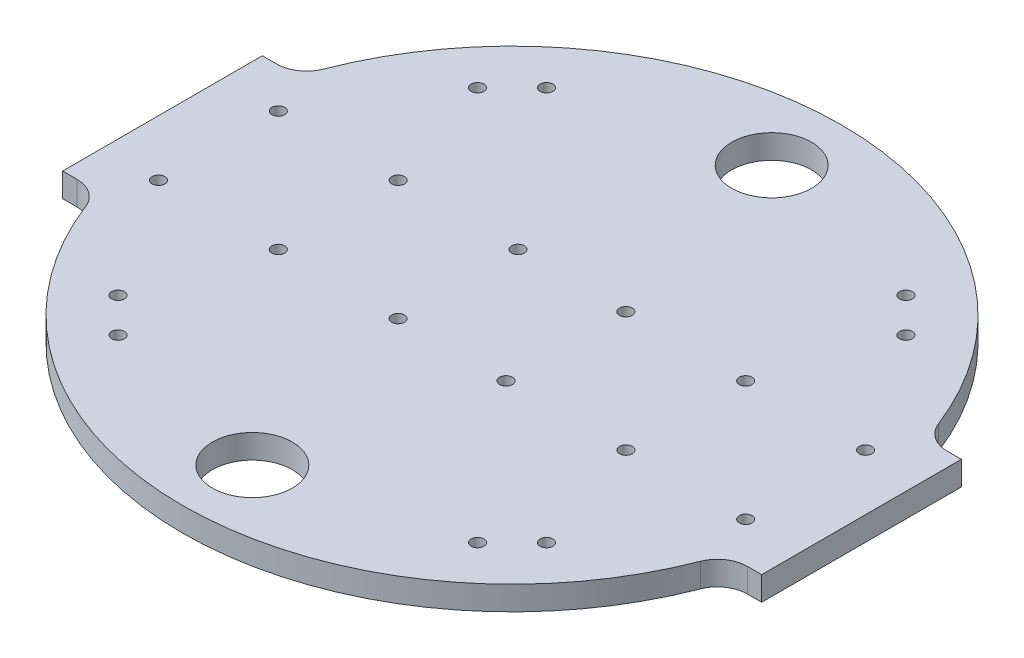
ISO-10303-21;
HEADER;
FILE_DESCRIPTION(('STEP AP214'),'2;1');
FILE_NAME('part.step','',(''),(''),'','','');
FILE_SCHEMA(('AUTOMOTIVE_DESIGN { 1 0 10303 214 1 1 1 1 }'));
ENDSEC;
DATA;
#1=APPLICATION_CONTEXT('core data for automotive mechanical design processes');
#2=APPLICATION_PROTOCOL_DEFINITION('international standard','automotive_design',2000,#1);
#3=PRODUCT_CONTEXT('',#1,'mechanical');
#4=PRODUCT('Part','Part','',(#3));
#5=PRODUCT_RELATED_PRODUCT_CATEGORY('part','',(#4));
#6=PRODUCT_DEFINITION_FORMATION('','',#4);
#7=PRODUCT_DEFINITION_CONTEXT('part definition',#1,'design');
#8=PRODUCT_DEFINITION('design','',#6,#7);
#9=PRODUCT_DEFINITION_SHAPE('','',#8);
#10=(LENGTH_UNIT() NAMED_UNIT(*) SI_UNIT(.MILLI.,.METRE.));
#11=(NAMED_UNIT(*) PLANE_ANGLE_UNIT() SI_UNIT($,.RADIAN.));
#12=(NAMED_UNIT(*) SI_UNIT($,.STERADIAN.) SOLID_ANGLE_UNIT());
#13=UNCERTAINTY_MEASURE_WITH_UNIT(LENGTH_MEASURE(1.E-05),#10,'distance_accuracy_value','');
#14=(GEOMETRIC_REPRESENTATION_CONTEXT(3) GLOBAL_UNCERTAINTY_ASSIGNED_CONTEXT((#13)) GLOBAL_UNIT_ASSIGNED_CONTEXT((#10,
#11,#12)) REPRESENTATION_CONTEXT('',''));
#15=CARTESIAN_POINT('',(0.,0.,0.));
#16=DIRECTION('',(0.,0.,1.));
#17=DIRECTION('',(1.,0.,0.));
#18=AXIS2_PLACEMENT_3D('',#15,#16,#17);
#19=CARTESIAN_POINT('',(0.,6.,0.));
#20=DIRECTION('',(0.,1.,0.));
#21=DIRECTION('',(0.,0.,1.));
#22=AXIS2_PLACEMENT_3D('',#19,#20,#21);
#23=PLANE('',#22);
#24=CARTESIAN_POINT('',(73.5,6.,15.));
#25=DIRECTION('',(0.,1.,0.));
#26=DIRECTION('',(0.,0.,1.));
#27=AXIS2_PLACEMENT_3D('',#24,#25,#26);
#28=CIRCLE('',#27,1.6);
#29=CARTESIAN_POINT('',(73.5,6.,16.6));
#30=VERTEX_POINT('',#29);
#31=EDGE_CURVE('E413',#30,#30,#28,.T.);
#32=ORIENTED_EDGE('',*,*,#31,.F.);
#33=EDGE_LOOP('',(#32));
#34=FACE_BOUND('',#33,.T.);
#35=CARTESIAN_POINT('',(43.5,6.,-15.));
#36=DIRECTION('',(0.,1.,0.));
#37=DIRECTION('',(0.,0.,-1.));
#38=AXIS2_PLACEMENT_3D('',#35,#36,#37);
#39=CIRCLE('',#38,1.6);
#40=CARTESIAN_POINT('',(43.5,6.,-16.6));
#41=VERTEX_POINT('',#40);
#42=EDGE_CURVE('E401',#41,#41,#39,.T.);
#43=ORIENTED_EDGE('',*,*,#42,.F.);
#44=EDGE_LOOP('',(#43));
#45=FACE_BOUND('',#44,.T.);
#46=CARTESIAN_POINT('',(-13.5,6.,15.));
#47=DIRECTION('',(0.,1.,0.));
#48=DIRECTION('',(0.,0.,-1.));
#49=AXIS2_PLACEMENT_3D('',#46,#47,#48);
#50=CIRCLE('',#49,1.6);
#51=CARTESIAN_POINT('',(-13.5,6.,13.4));
#52=VERTEX_POINT('',#51);
#53=EDGE_CURVE('E389',#52,#52,#50,.T.);
#54=ORIENTED_EDGE('',*,*,#53,.F.);
#55=EDGE_LOOP('',(#54));
#56=FACE_BOUND('',#55,.T.);
#57=CARTESIAN_POINT('',(-43.5,6.,15.));
#58=DIRECTION('',(0.,1.,0.));
#59=DIRECTION('',(0.,0.,-1.));
#60=AXIS2_PLACEMENT_3D('',#57,#58,#59);
#61=CIRCLE('',#60,1.6);
#62=CARTESIAN_POINT('',(-43.5,6.,13.4));
#63=VERTEX_POINT('',#62);
#64=EDGE_CURVE('E377',#63,#63,#61,.T.);
#65=ORIENTED_EDGE('',*,*,#64,.F.);
#66=EDGE_LOOP('',(#65));
#67=FACE_BOUND('',#66,.T.);
#68=CARTESIAN_POINT('',(13.5,6.,15.));
#69=DIRECTION('',(0.,1.,0.));
#70=DIRECTION('',(0.,0.,1.));
#71=AXIS2_PLACEMENT_3D('',#68,#69,#70);
#72=CIRCLE('',#71,1.6);
#73=CARTESIAN_POINT('',(13.5,6.,16.6));
#74=VERTEX_POINT('',#73);
#75=EDGE_CURVE('E365',#74,#74,#72,.T.);
#76=ORIENTED_EDGE('',*,*,#75,.F.);
#77=EDGE_LOOP('',(#76));
#78=FACE_BOUND('',#77,.T.);
#79=CARTESIAN_POINT('',(-73.5,6.,-15.));
#80=DIRECTION('',(0.,1.,0.));
#81=DIRECTION('',(0.,0.,1.));
#82=AXIS2_PLACEMENT_3D('',#79,#80,#81);
#83=CIRCLE('',#82,1.6);
#84=CARTESIAN_POINT('',(-73.5,6.,-13.4));
#85=VERTEX_POINT('',#84);
#86=EDGE_CURVE('E353',#85,#85,#83,.T.);
#87=ORIENTED_EDGE('',*,*,#86,.F.);
#88=EDGE_LOOP('',(#87));
#89=FACE_BOUND('',#88,.T.);
#90=CARTESIAN_POINT('',(-53.6231110183226,6.,44.9951326780585));
#91=DIRECTION('',(0.,1.,0.));
#92=DIRECTION('',(0.,0.,1.));
#93=AXIS2_PLACEMENT_3D('',#90,#91,#92);
#94=CIRCLE('',#93,1.60000000000277);
#95=CARTESIAN_POINT('',(-53.6231110183226,6.,46.5951326780613));
#96=VERTEX_POINT('',#95);
#97=EDGE_CURVE('E341',#96,#96,#94,.T.);
#98=ORIENTED_EDGE('',*,*,#97,.F.);
#99=EDGE_LOOP('',(#98));
#100=FACE_BOUND('',#99,.T.);
#101=CARTESIAN_POINT('',(44.9951326780641,6.,53.6231110183231));
#102=DIRECTION('',(0.,1.,0.));
#103=DIRECTION('',(0.,0.,1.));
#104=AXIS2_PLACEMENT_3D('',#101,#102,#103);
#105=CIRCLE('',#104,1.60000000000774);
#106=CARTESIAN_POINT('',(44.9951326780641,6.,55.2231110183308));
#107=VERTEX_POINT('',#106);
#108=EDGE_CURVE('E329',#107,#107,#105,.T.);
#109=ORIENTED_EDGE('',*,*,#108,.F.);
#110=EDGE_LOOP('',(#109));
#111=FACE_BOUND('',#110,.T.);
#112=CARTESIAN_POINT('',(53.6231110183287,6.,-44.9951326780636));
#113=DIRECTION('',(0.,1.,0.));
#114=DIRECTION('',(0.,0.,1.));
#115=AXIS2_PLACEMENT_3D('',#112,#113,#114);
#116=CIRCLE('',#115,1.60000000000543);
#117=CARTESIAN_POINT('',(53.6231110183287,6.,-43.3951326780582));
#118=VERTEX_POINT('',#117);
#119=EDGE_CURVE('E317',#118,#118,#116,.T.);
#120=ORIENTED_EDGE('',*,*,#119,.F.);
#121=EDGE_LOOP('',(#120));
#122=FACE_BOUND('',#121,.T.);
#123=CARTESIAN_POINT('',(0.,6.,-65.));
#124=DIRECTION('',(0.,1.,0.));
#125=DIRECTION('',(0.,0.,1.));
#126=AXIS2_PLACEMENT_3D('',#123,#124,#125);
#127=CIRCLE('',#126,10.);
#128=CARTESIAN_POINT('',(0.,6.,-55.));
#129=VERTEX_POINT('',#128);
#130=EDGE_CURVE('E305',#129,#129,#127,.T.);
#131=ORIENTED_EDGE('',*,*,#130,.F.);
#132=EDGE_LOOP('',(#131));
#133=FACE_BOUND('',#132,.T.);
#134=CARTESIAN_POINT('',(-53.6231110183287,6.,-44.9951326780575));
#135=DIRECTION('',(0.,1.,0.));
#136=DIRECTION('',(0.,0.,1.));
#137=AXIS2_PLACEMENT_3D('',#134,#135,#136);
#138=CIRCLE('',#137,1.6);
#139=CARTESIAN_POINT('',(-53.6231110183287,6.,-43.3951326780575));
#140=VERTEX_POINT('',#139);
#141=EDGE_CURVE('E159',#140,#140,#138,.T.);
#142=ORIENTED_EDGE('',*,*,#141,.F.);
#143=EDGE_LOOP('',(#142));
#144=FACE_BOUND('',#143,.T.);
#145=DIRECTION('',(1.,0.,0.));
#146=VECTOR('',#145,1.);
#147=CARTESIAN_POINT('',(-87.5,6.,25.));
#148=LINE('',#147,#146);
#149=CARTESIAN_POINT('',(-87.5,6.,25.));
#150=VERTEX_POINT('',#149);
#151=CARTESIAN_POINT('',(-83.9270516579726,6.,25.));
#152=VERTEX_POINT('',#151);
#153=EDGE_CURVE('E175',#150,#152,#148,.T.);
#154=ORIENTED_EDGE('',*,*,#153,.T.);
#155=CARTESIAN_POINT('',(-83.9270516579726,6.,32.5));
#156=DIRECTION('',(0.,1.,0.));
#157=DIRECTION('',(0.,0.,1.));
#158=AXIS2_PLACEMENT_3D('',#155,#156,#157);
#159=CIRCLE('',#158,7.5);
#160=CARTESIAN_POINT('',(-76.9331306864749,6.,29.7916666666667));
#161=VERTEX_POINT('',#160);
#162=EDGE_CURVE('E202',#152,#161,#159,.F.);
#163=ORIENTED_EDGE('',*,*,#162,.T.);
#164=CARTESIAN_POINT('',(0.,6.,0.));
#165=DIRECTION('',(0.,1.,0.));
#166=DIRECTION('',(0.,0.,1.));
#167=AXIS2_PLACEMENT_3D('',#164,#165,#166);
#168=CIRCLE('',#167,82.5);
#169=CARTESIAN_POINT('',(76.9331306864749,6.,29.7916666666667));
#170=VERTEX_POINT('',#169);
#171=EDGE_CURVE('E127',#161,#170,#168,.T.);
#172=ORIENTED_EDGE('',*,*,#171,.T.);
#173=CARTESIAN_POINT('',(83.9270516579726,6.,32.5));
#174=DIRECTION('',(0.,1.,0.));
#175=DIRECTION('',(0.,0.,1.));
#176=AXIS2_PLACEMENT_3D('',#173,#174,#175);
#177=CIRCLE('',#176,7.5);
#178=CARTESIAN_POINT('',(83.9270516579726,6.,25.));
#179=VERTEX_POINT('',#178);
#180=EDGE_CURVE('E11',#170,#179,#177,.F.);
#181=ORIENTED_EDGE('',*,*,#180,.T.);
#182=DIRECTION('',(1.,0.,0.));
#183=VECTOR('',#182,1.);
#184=CARTESIAN_POINT('',(87.5,6.,25.));
#185=LINE('',#184,#183);
#186=CARTESIAN_POINT('',(87.5,6.,25.));
#187=VERTEX_POINT('',#186);
#188=EDGE_CURVE('E118',#179,#187,#185,.T.);
#189=ORIENTED_EDGE('',*,*,#188,.T.);
#190=DIRECTION('',(0.,0.,-1.));
#191=VECTOR('',#190,1.);
#192=CARTESIAN_POINT('',(87.5,6.,25.));
#193=LINE('',#192,#191);
#194=CARTESIAN_POINT('',(87.5,6.,-25.));
#195=VERTEX_POINT('',#194);
#196=EDGE_CURVE('E124',#187,#195,#193,.T.);
#197=ORIENTED_EDGE('',*,*,#196,.T.);
#198=DIRECTION('',(-1.,0.,0.));
#199=VECTOR('',#198,1.);
#200=CARTESIAN_POINT('',(87.5,6.,-25.));
#201=LINE('',#200,#199);
#202=CARTESIAN_POINT('',(83.9270516579726,6.,-25.));
#203=VERTEX_POINT('',#202);
#204=EDGE_CURVE('E142',#195,#203,#201,.T.);
#205=ORIENTED_EDGE('',*,*,#204,.T.);
#206=CARTESIAN_POINT('',(83.9270516579726,6.,-32.5));
#207=DIRECTION('',(0.,1.,0.));
#208=DIRECTION('',(0.,0.,1.));
#209=AXIS2_PLACEMENT_3D('',#206,#207,#208);
#210=CIRCLE('',#209,7.5);
#211=CARTESIAN_POINT('',(76.9331306864749,6.,-29.7916666666667));
#212=VERTEX_POINT('',#211);
#213=EDGE_CURVE('E210',#203,#212,#210,.F.);
#214=ORIENTED_EDGE('',*,*,#213,.T.);
#215=CARTESIAN_POINT('',(0.,6.,0.));
#216=DIRECTION('',(0.,1.,0.));
#217=DIRECTION('',(0.,0.,1.));
#218=AXIS2_PLACEMENT_3D('',#215,#216,#217);
#219=CIRCLE('',#218,82.5);
#220=CARTESIAN_POINT('',(-76.9331306864749,6.,-29.7916666666667));
#221=VERTEX_POINT('',#220);
#222=EDGE_CURVE('E144',#212,#221,#219,.T.);
#223=ORIENTED_EDGE('',*,*,#222,.T.);
#224=CARTESIAN_POINT('',(-83.9270516579726,6.,-32.5));
#225=DIRECTION('',(0.,1.,0.));
#226=DIRECTION('',(0.,0.,1.));
#227=AXIS2_PLACEMENT_3D('',#224,#225,#226);
#228=CIRCLE('',#227,7.5);
#229=CARTESIAN_POINT('',(-83.9270516579726,6.,-25.));
#230=VERTEX_POINT('',#229);
#231=EDGE_CURVE('E206',#221,#230,#228,.F.);
#232=ORIENTED_EDGE('',*,*,#231,.T.);
#233=DIRECTION('',(-1.,0.,0.));
#234=VECTOR('',#233,1.);
#235=CARTESIAN_POINT('',(-87.5,6.,-25.));
#236=LINE('',#235,#234);
#237=CARTESIAN_POINT('',(-87.5,6.,-25.));
#238=VERTEX_POINT('',#237);
#239=EDGE_CURVE('E150',#230,#238,#236,.T.);
#240=ORIENTED_EDGE('',*,*,#239,.T.);
#241=DIRECTION('',(0.,0.,1.));
#242=VECTOR('',#241,1.);
#243=CARTESIAN_POINT('',(-87.5,6.,25.));
#244=LINE('',#243,#242);
#245=EDGE_CURVE('E152',#238,#150,#244,.T.);
#246=ORIENTED_EDGE('',*,*,#245,.T.);
#247=EDGE_LOOP('',(#154,#163,#172,#181,#189,#197,#205,#214,#223,#232,#240,#246));
#248=FACE_BOUND('',#247,.T.);
#249=CARTESIAN_POINT('',(-44.9951326780581,6.,-53.6231110183282));
#250=DIRECTION('',(0.,1.,0.));
#251=DIRECTION('',(0.,0.,1.));
#252=AXIS2_PLACEMENT_3D('',#249,#250,#251);
#253=CIRCLE('',#252,1.59999999999999);
#254=CARTESIAN_POINT('',(-44.9951326780581,6.,-52.0231110183282));
#255=VERTEX_POINT('',#254);
#256=EDGE_CURVE('E299',#255,#255,#253,.T.);
#257=ORIENTED_EDGE('',*,*,#256,.F.);
#258=EDGE_LOOP('',(#257));
#259=FACE_BOUND('',#258,.T.);
#260=CARTESIAN_POINT('',(44.9951326780579,6.,-53.6231110183343));
#261=DIRECTION('',(0.,1.,0.));
#262=DIRECTION('',(0.,0.,1.));
#263=AXIS2_PLACEMENT_3D('',#260,#261,#262);
#264=CIRCLE('',#263,1.60000000000543);
#265=CARTESIAN_POINT('',(44.9951326780579,6.,-52.0231110183289));
#266=VERTEX_POINT('',#265);
#267=EDGE_CURVE('E311',#266,#266,#264,.T.);
#268=ORIENTED_EDGE('',*,*,#267,.F.);
#269=EDGE_LOOP('',(#268));
#270=FACE_BOUND('',#269,.T.);
#271=CARTESIAN_POINT('',(53.6231110183348,6.,44.9951326780523));
#272=DIRECTION('',(0.,1.,0.));
#273=DIRECTION('',(0.,0.,1.));
#274=AXIS2_PLACEMENT_3D('',#271,#272,#273);
#275=CIRCLE('',#274,1.60000000000772);
#276=CARTESIAN_POINT('',(53.6231110183348,6.,46.59513267806));
#277=VERTEX_POINT('',#276);
#278=EDGE_CURVE('E323',#277,#277,#275,.T.);
#279=ORIENTED_EDGE('',*,*,#278,.F.);
#280=EDGE_LOOP('',(#279));
#281=FACE_BOUND('',#280,.T.);
#282=CARTESIAN_POINT('',(-44.9951326780519,6.,53.6231110183292));
#283=DIRECTION('',(0.,1.,0.));
#284=DIRECTION('',(0.,0.,1.));
#285=AXIS2_PLACEMENT_3D('',#282,#283,#284);
#286=CIRCLE('',#285,1.60000000000273);
#287=CARTESIAN_POINT('',(-44.9951326780519,6.,55.223111018332));
#288=VERTEX_POINT('',#287);
#289=EDGE_CURVE('E335',#288,#288,#286,.T.);
#290=ORIENTED_EDGE('',*,*,#289,.F.);
#291=EDGE_LOOP('',(#290));
#292=FACE_BOUND('',#291,.T.);
#293=CARTESIAN_POINT('',(0.,6.,65.));
#294=DIRECTION('',(0.,1.,0.));
#295=DIRECTION('',(0.,0.,-1.));
#296=AXIS2_PLACEMENT_3D('',#293,#294,#295);
#297=CIRCLE('',#296,10.);
#298=CARTESIAN_POINT('',(0.,6.,55.));
#299=VERTEX_POINT('',#298);
#300=EDGE_CURVE('E347',#299,#299,#297,.T.);
#301=ORIENTED_EDGE('',*,*,#300,.F.);
#302=EDGE_LOOP('',(#301));
#303=FACE_BOUND('',#302,.T.);
#304=CARTESIAN_POINT('',(-73.5,6.,15.));
#305=DIRECTION('',(0.,1.,0.));
#306=DIRECTION('',(0.,0.,-1.));
#307=AXIS2_PLACEMENT_3D('',#304,#305,#306);
#308=CIRCLE('',#307,1.6);
#309=CARTESIAN_POINT('',(-73.5,6.,13.4));
#310=VERTEX_POINT('',#309);
#311=EDGE_CURVE('E359',#310,#310,#308,.T.);
#312=ORIENTED_EDGE('',*,*,#311,.F.);
#313=EDGE_LOOP('',(#312));
#314=FACE_BOUND('',#313,.T.);
#315=CARTESIAN_POINT('',(-43.5,6.,-15.));
#316=DIRECTION('',(0.,1.,0.));
#317=DIRECTION('',(0.,0.,1.));
#318=AXIS2_PLACEMENT_3D('',#315,#316,#317);
#319=CIRCLE('',#318,1.6);
#320=CARTESIAN_POINT('',(-43.5,6.,-13.4));
#321=VERTEX_POINT('',#320);
#322=EDGE_CURVE('E371',#321,#321,#319,.T.);
#323=ORIENTED_EDGE('',*,*,#322,.F.);
#324=EDGE_LOOP('',(#323));
#325=FACE_BOUND('',#324,.T.);
#326=CARTESIAN_POINT('',(-13.5,6.,-15.));
#327=DIRECTION('',(0.,1.,0.));
#328=DIRECTION('',(0.,0.,1.));
#329=AXIS2_PLACEMENT_3D('',#326,#327,#328);
#330=CIRCLE('',#329,1.6);
#331=CARTESIAN_POINT('',(-13.5,6.,-13.4));
#332=VERTEX_POINT('',#331);
#333=EDGE_CURVE('E383',#332,#332,#330,.T.);
#334=ORIENTED_EDGE('',*,*,#333,.F.);
#335=EDGE_LOOP('',(#334));
#336=FACE_BOUND('',#335,.T.);
#337=CARTESIAN_POINT('',(13.5,6.,-15.));
#338=DIRECTION('',(0.,1.,0.));
#339=DIRECTION('',(0.,0.,-1.));
#340=AXIS2_PLACEMENT_3D('',#337,#338,#339);
#341=CIRCLE('',#340,1.6);
#342=CARTESIAN_POINT('',(13.5,6.,-16.6));
#343=VERTEX_POINT('',#342);
#344=EDGE_CURVE('E395',#343,#343,#341,.T.);
#345=ORIENTED_EDGE('',*,*,#344,.F.);
#346=EDGE_LOOP('',(#345));
#347=FACE_BOUND('',#346,.T.);
#348=CARTESIAN_POINT('',(43.5,6.,15.));
#349=DIRECTION('',(0.,1.,0.));
#350=DIRECTION('',(0.,0.,1.));
#351=AXIS2_PLACEMENT_3D('',#348,#349,#350);
#352=CIRCLE('',#351,1.6);
#353=CARTESIAN_POINT('',(43.5,6.,16.6));
#354=VERTEX_POINT('',#353);
#355=EDGE_CURVE('E407',#354,#354,#352,.T.);
#356=ORIENTED_EDGE('',*,*,#355,.F.);
#357=EDGE_LOOP('',(#356));
#358=FACE_BOUND('',#357,.T.);
#359=CARTESIAN_POINT('',(73.5,6.,-15.));
#360=DIRECTION('',(0.,1.,0.));
#361=DIRECTION('',(0.,0.,-1.));
#362=AXIS2_PLACEMENT_3D('',#359,#360,#361);
#363=CIRCLE('',#362,1.6);
#364=CARTESIAN_POINT('',(73.5,6.,-16.6));
#365=VERTEX_POINT('',#364);
#366=EDGE_CURVE('E419',#365,#365,#363,.T.);
#367=ORIENTED_EDGE('',*,*,#366,.F.);
#368=EDGE_LOOP('',(#367));
#369=FACE_BOUND('',#368,.T.);
#370=ADVANCED_FACE('F33',(#34,#45,#56,#67,#78,#89,#100,#111,#122,#133,#144,#248,#259,#270,#281,
#292,#303,#314,#325,#336,#347,#358,#369),#23,.T.);
#371=CARTESIAN_POINT('',(0.,0.,0.));
#372=DIRECTION('',(0.,1.,0.));
#373=DIRECTION('',(0.,0.,1.));
#374=AXIS2_PLACEMENT_3D('',#371,#372,#373);
#375=PLANE('',#374);
#376=CARTESIAN_POINT('',(73.5,0.,15.));
#377=DIRECTION('',(0.,1.,0.));
#378=DIRECTION('',(0.,0.,1.));
#379=AXIS2_PLACEMENT_3D('',#376,#377,#378);
#380=CIRCLE('',#379,1.6);
#381=CARTESIAN_POINT('',(73.5,0.,16.6));
#382=VERTEX_POINT('',#381);
#383=EDGE_CURVE('E416',#382,#382,#380,.T.);
#384=ORIENTED_EDGE('',*,*,#383,.T.);
#385=EDGE_LOOP('',(#384));
#386=FACE_BOUND('',#385,.T.);
#387=CARTESIAN_POINT('',(43.5,0.,-15.));
#388=DIRECTION('',(0.,1.,0.));
#389=DIRECTION('',(0.,0.,-1.));
#390=AXIS2_PLACEMENT_3D('',#387,#388,#389);
#391=CIRCLE('',#390,1.6);
#392=CARTESIAN_POINT('',(43.5,0.,-16.6));
#393=VERTEX_POINT('',#392);
#394=EDGE_CURVE('E404',#393,#393,#391,.T.);
#395=ORIENTED_EDGE('',*,*,#394,.T.);
#396=EDGE_LOOP('',(#395));
#397=FACE_BOUND('',#396,.T.);
#398=CARTESIAN_POINT('',(-13.5,0.,15.));
#399=DIRECTION('',(0.,1.,0.));
#400=DIRECTION('',(0.,0.,-1.));
#401=AXIS2_PLACEMENT_3D('',#398,#399,#400);
#402=CIRCLE('',#401,1.6);
#403=CARTESIAN_POINT('',(-13.5,0.,13.4));
#404=VERTEX_POINT('',#403);
#405=EDGE_CURVE('E392',#404,#404,#402,.T.);
#406=ORIENTED_EDGE('',*,*,#405,.T.);
#407=EDGE_LOOP('',(#406));
#408=FACE_BOUND('',#407,.T.);
#409=CARTESIAN_POINT('',(-43.5,0.,15.));
#410=DIRECTION('',(0.,1.,0.));
#411=DIRECTION('',(0.,0.,-1.));
#412=AXIS2_PLACEMENT_3D('',#409,#410,#411);
#413=CIRCLE('',#412,1.6);
#414=CARTESIAN_POINT('',(-43.5,0.,13.4));
#415=VERTEX_POINT('',#414);
#416=EDGE_CURVE('E380',#415,#415,#413,.T.);
#417=ORIENTED_EDGE('',*,*,#416,.T.);
#418=EDGE_LOOP('',(#417));
#419=FACE_BOUND('',#418,.T.);
#420=CARTESIAN_POINT('',(13.5,0.,15.));
#421=DIRECTION('',(0.,1.,0.));
#422=DIRECTION('',(0.,0.,1.));
#423=AXIS2_PLACEMENT_3D('',#420,#421,#422);
#424=CIRCLE('',#423,1.6);
#425=CARTESIAN_POINT('',(13.5,0.,16.6));
#426=VERTEX_POINT('',#425);
#427=EDGE_CURVE('E368',#426,#426,#424,.T.);
#428=ORIENTED_EDGE('',*,*,#427,.T.);
#429=EDGE_LOOP('',(#428));
#430=FACE_BOUND('',#429,.T.);
#431=CARTESIAN_POINT('',(-73.5,0.,-15.));
#432=DIRECTION('',(0.,1.,0.));
#433=DIRECTION('',(0.,0.,1.));
#434=AXIS2_PLACEMENT_3D('',#431,#432,#433);
#435=CIRCLE('',#434,1.6);
#436=CARTESIAN_POINT('',(-73.5,0.,-13.4));
#437=VERTEX_POINT('',#436);
#438=EDGE_CURVE('E356',#437,#437,#435,.T.);
#439=ORIENTED_EDGE('',*,*,#438,.T.);
#440=EDGE_LOOP('',(#439));
#441=FACE_BOUND('',#440,.T.);
#442=CARTESIAN_POINT('',(-53.6231110183226,0.,44.9951326780585));
#443=DIRECTION('',(0.,1.,0.));
#444=DIRECTION('',(0.,0.,1.));
#445=AXIS2_PLACEMENT_3D('',#442,#443,#444);
#446=CIRCLE('',#445,1.60000000000277);
#447=CARTESIAN_POINT('',(-53.6231110183226,0.,46.5951326780613));
#448=VERTEX_POINT('',#447);
#449=EDGE_CURVE('E344',#448,#448,#446,.T.);
#450=ORIENTED_EDGE('',*,*,#449,.T.);
#451=EDGE_LOOP('',(#450));
#452=FACE_BOUND('',#451,.T.);
#453=CARTESIAN_POINT('',(44.9951326780641,0.,53.6231110183231));
#454=DIRECTION('',(0.,1.,0.));
#455=DIRECTION('',(0.,0.,1.));
#456=AXIS2_PLACEMENT_3D('',#453,#454,#455);
#457=CIRCLE('',#456,1.60000000000774);
#458=CARTESIAN_POINT('',(44.9951326780641,0.,55.2231110183308));
#459=VERTEX_POINT('',#458);
#460=EDGE_CURVE('E332',#459,#459,#457,.T.);
#461=ORIENTED_EDGE('',*,*,#460,.T.);
#462=EDGE_LOOP('',(#461));
#463=FACE_BOUND('',#462,.T.);
#464=CARTESIAN_POINT('',(53.6231110183287,0.,-44.9951326780636));
#465=DIRECTION('',(0.,1.,0.));
#466=DIRECTION('',(0.,0.,1.));
#467=AXIS2_PLACEMENT_3D('',#464,#465,#466);
#468=CIRCLE('',#467,1.60000000000543);
#469=CARTESIAN_POINT('',(53.6231110183287,0.,-43.3951326780582));
#470=VERTEX_POINT('',#469);
#471=EDGE_CURVE('E320',#470,#470,#468,.T.);
#472=ORIENTED_EDGE('',*,*,#471,.T.);
#473=EDGE_LOOP('',(#472));
#474=FACE_BOUND('',#473,.T.);
#475=CARTESIAN_POINT('',(0.,0.,-65.));
#476=DIRECTION('',(0.,1.,0.));
#477=DIRECTION('',(0.,0.,1.));
#478=AXIS2_PLACEMENT_3D('',#475,#476,#477);
#479=CIRCLE('',#478,10.);
#480=CARTESIAN_POINT('',(0.,0.,-55.));
#481=VERTEX_POINT('',#480);
#482=EDGE_CURVE('E308',#481,#481,#479,.T.);
#483=ORIENTED_EDGE('',*,*,#482,.T.);
#484=EDGE_LOOP('',(#483));
#485=FACE_BOUND('',#484,.T.);
#486=CARTESIAN_POINT('',(-53.6231110183287,0.,-44.9951326780575));
#487=DIRECTION('',(0.,1.,0.));
#488=DIRECTION('',(0.,0.,1.));
#489=AXIS2_PLACEMENT_3D('',#486,#487,#488);
#490=CIRCLE('',#489,1.6);
#491=CARTESIAN_POINT('',(-53.6231110183287,0.,-43.3951326780575));
#492=VERTEX_POINT('',#491);
#493=EDGE_CURVE('E296',#492,#492,#490,.T.);
#494=ORIENTED_EDGE('',*,*,#493,.T.);
#495=EDGE_LOOP('',(#494));
#496=FACE_BOUND('',#495,.T.);
#497=DIRECTION('',(1.,0.,0.));
#498=VECTOR('',#497,1.);
#499=CARTESIAN_POINT('',(-87.5,0.,25.));
#500=LINE('',#499,#498);
#501=CARTESIAN_POINT('',(-87.5,0.,25.));
#502=VERTEX_POINT('',#501);
#503=CARTESIAN_POINT('',(-83.9270516579726,0.,25.));
#504=VERTEX_POINT('',#503);
#505=EDGE_CURVE('E155',#502,#504,#500,.T.);
#506=ORIENTED_EDGE('',*,*,#505,.F.);
#507=DIRECTION('',(0.,0.,1.));
#508=VECTOR('',#507,1.);
#509=CARTESIAN_POINT('',(-87.5,0.,25.));
#510=LINE('',#509,#508);
#511=CARTESIAN_POINT('',(-87.5,0.,-25.));
#512=VERTEX_POINT('',#511);
#513=EDGE_CURVE('E173',#512,#502,#510,.T.);
#514=ORIENTED_EDGE('',*,*,#513,.F.);
#515=DIRECTION('',(-1.,0.,0.));
#516=VECTOR('',#515,1.);
#517=CARTESIAN_POINT('',(-87.5,0.,-25.));
#518=LINE('',#517,#516);
#519=CARTESIAN_POINT('',(-83.9270516579726,0.,-25.));
#520=VERTEX_POINT('',#519);
#521=EDGE_CURVE('E171',#520,#512,#518,.T.);
#522=ORIENTED_EDGE('',*,*,#521,.F.);
#523=CARTESIAN_POINT('',(-83.9270516579726,0.,-32.5));
#524=DIRECTION('',(0.,1.,0.));
#525=DIRECTION('',(0.,0.,1.));
#526=AXIS2_PLACEMENT_3D('',#523,#524,#525);
#527=CIRCLE('',#526,7.5);
#528=CARTESIAN_POINT('',(-76.9331306864749,0.,-29.7916666666667));
#529=VERTEX_POINT('',#528);
#530=EDGE_CURVE('E204',#520,#529,#527,.T.);
#531=ORIENTED_EDGE('',*,*,#530,.T.);
#532=CARTESIAN_POINT('',(0.,0.,0.));
#533=DIRECTION('',(0.,1.,0.));
#534=DIRECTION('',(0.,0.,1.));
#535=AXIS2_PLACEMENT_3D('',#532,#533,#534);
#536=CIRCLE('',#535,82.5);
#537=CARTESIAN_POINT('',(76.9331306864749,0.,-29.7916666666667));
#538=VERTEX_POINT('',#537);
#539=EDGE_CURVE('E168',#538,#529,#536,.T.);
#540=ORIENTED_EDGE('',*,*,#539,.F.);
#541=CARTESIAN_POINT('',(83.9270516579726,0.,-32.5));
#542=DIRECTION('',(0.,1.,0.));
#543=DIRECTION('',(0.,0.,1.));
#544=AXIS2_PLACEMENT_3D('',#541,#542,#543);
#545=CIRCLE('',#544,7.5);
#546=CARTESIAN_POINT('',(83.9270516579726,0.,-25.));
#547=VERTEX_POINT('',#546);
#548=EDGE_CURVE('E208',#538,#547,#545,.T.);
#549=ORIENTED_EDGE('',*,*,#548,.T.);
#550=DIRECTION('',(-1.,0.,0.));
#551=VECTOR('',#550,1.);
#552=CARTESIAN_POINT('',(87.5,0.,-25.));
#553=LINE('',#552,#551);
#554=CARTESIAN_POINT('',(87.5,0.,-25.));
#555=VERTEX_POINT('',#554);
#556=EDGE_CURVE('E165',#555,#547,#553,.T.);
#557=ORIENTED_EDGE('',*,*,#556,.F.);
#558=DIRECTION('',(0.,0.,-1.));
#559=VECTOR('',#558,1.);
#560=CARTESIAN_POINT('',(87.5,0.,25.));
#561=LINE('',#560,#559);
#562=CARTESIAN_POINT('',(87.5,0.,25.));
#563=VERTEX_POINT('',#562);
#564=EDGE_CURVE('E163',#563,#555,#561,.T.);
#565=ORIENTED_EDGE('',*,*,#564,.F.);
#566=DIRECTION('',(1.,0.,0.));
#567=VECTOR('',#566,1.);
#568=CARTESIAN_POINT('',(87.5,0.,25.));
#569=LINE('',#568,#567);
#570=CARTESIAN_POINT('',(83.9270516579726,0.,25.));
#571=VERTEX_POINT('',#570);
#572=EDGE_CURVE('E133',#571,#563,#569,.T.);
#573=ORIENTED_EDGE('',*,*,#572,.F.);
#574=CARTESIAN_POINT('',(83.9270516579726,0.,32.5));
#575=DIRECTION('',(0.,1.,0.));
#576=DIRECTION('',(0.,0.,1.));
#577=AXIS2_PLACEMENT_3D('',#574,#575,#576);
#578=CIRCLE('',#577,7.5);
#579=CARTESIAN_POINT('',(76.9331306864749,0.,29.7916666666667));
#580=VERTEX_POINT('',#579);
#581=EDGE_CURVE('E41',#571,#580,#578,.T.);
#582=ORIENTED_EDGE('',*,*,#581,.T.);
#583=CARTESIAN_POINT('',(0.,0.,0.));
#584=DIRECTION('',(0.,1.,0.));
#585=DIRECTION('',(0.,0.,1.));
#586=AXIS2_PLACEMENT_3D('',#583,#584,#585);
#587=CIRCLE('',#586,82.5);
#588=CARTESIAN_POINT('',(-76.9331306864749,0.,29.7916666666667));
#589=VERTEX_POINT('',#588);
#590=EDGE_CURVE('E158',#589,#580,#587,.T.);
#591=ORIENTED_EDGE('',*,*,#590,.F.);
#592=CARTESIAN_POINT('',(-83.9270516579726,0.,32.5));
#593=DIRECTION('',(0.,1.,0.));
#594=DIRECTION('',(0.,0.,1.));
#595=AXIS2_PLACEMENT_3D('',#592,#593,#594);
#596=CIRCLE('',#595,7.5);
#597=EDGE_CURVE('E200',#589,#504,#596,.T.);
#598=ORIENTED_EDGE('',*,*,#597,.T.);
#599=EDGE_LOOP('',(#506,#514,#522,#531,#540,#549,#557,#565,#573,#582,#591,#598));
#600=FACE_BOUND('',#599,.T.);
#601=CARTESIAN_POINT('',(-44.9951326780581,0.,-53.6231110183282));
#602=DIRECTION('',(0.,1.,0.));
#603=DIRECTION('',(0.,0.,1.));
#604=AXIS2_PLACEMENT_3D('',#601,#602,#603);
#605=CIRCLE('',#604,1.59999999999999);
#606=CARTESIAN_POINT('',(-44.9951326780581,0.,-52.0231110183282));
#607=VERTEX_POINT('',#606);
#608=EDGE_CURVE('E302',#607,#607,#605,.T.);
#609=ORIENTED_EDGE('',*,*,#608,.T.);
#610=EDGE_LOOP('',(#609));
#611=FACE_BOUND('',#610,.T.);
#612=CARTESIAN_POINT('',(44.9951326780579,0.,-53.6231110183343));
#613=DIRECTION('',(0.,1.,0.));
#614=DIRECTION('',(0.,0.,1.));
#615=AXIS2_PLACEMENT_3D('',#612,#613,#614);
#616=CIRCLE('',#615,1.60000000000543);
#617=CARTESIAN_POINT('',(44.9951326780579,0.,-52.0231110183289));
#618=VERTEX_POINT('',#617);
#619=EDGE_CURVE('E314',#618,#618,#616,.T.);
#620=ORIENTED_EDGE('',*,*,#619,.T.);
#621=EDGE_LOOP('',(#620));
#622=FACE_BOUND('',#621,.T.);
#623=CARTESIAN_POINT('',(53.6231110183348,0.,44.9951326780523));
#624=DIRECTION('',(0.,1.,0.));
#625=DIRECTION('',(0.,0.,1.));
#626=AXIS2_PLACEMENT_3D('',#623,#624,#625);
#627=CIRCLE('',#626,1.60000000000772);
#628=CARTESIAN_POINT('',(53.6231110183348,0.,46.59513267806));
#629=VERTEX_POINT('',#628);
#630=EDGE_CURVE('E326',#629,#629,#627,.T.);
#631=ORIENTED_EDGE('',*,*,#630,.T.);
#632=EDGE_LOOP('',(#631));
#633=FACE_BOUND('',#632,.T.);
#634=CARTESIAN_POINT('',(-44.9951326780519,0.,53.6231110183292));
#635=DIRECTION('',(0.,1.,0.));
#636=DIRECTION('',(0.,0.,1.));
#637=AXIS2_PLACEMENT_3D('',#634,#635,#636);
#638=CIRCLE('',#637,1.60000000000273);
#639=CARTESIAN_POINT('',(-44.9951326780519,0.,55.223111018332));
#640=VERTEX_POINT('',#639);
#641=EDGE_CURVE('E338',#640,#640,#638,.T.);
#642=ORIENTED_EDGE('',*,*,#641,.T.);
#643=EDGE_LOOP('',(#642));
#644=FACE_BOUND('',#643,.T.);
#645=CARTESIAN_POINT('',(0.,0.,65.));
#646=DIRECTION('',(0.,1.,0.));
#647=DIRECTION('',(0.,0.,-1.));
#648=AXIS2_PLACEMENT_3D('',#645,#646,#647);
#649=CIRCLE('',#648,10.);
#650=CARTESIAN_POINT('',(0.,0.,55.));
#651=VERTEX_POINT('',#650);
#652=EDGE_CURVE('E350',#651,#651,#649,.T.);
#653=ORIENTED_EDGE('',*,*,#652,.T.);
#654=EDGE_LOOP('',(#653));
#655=FACE_BOUND('',#654,.T.);
#656=CARTESIAN_POINT('',(-73.5,0.,15.));
#657=DIRECTION('',(0.,1.,0.));
#658=DIRECTION('',(0.,0.,-1.));
#659=AXIS2_PLACEMENT_3D('',#656,#657,#658);
#660=CIRCLE('',#659,1.6);
#661=CARTESIAN_POINT('',(-73.5,0.,13.4));
#662=VERTEX_POINT('',#661);
#663=EDGE_CURVE('E362',#662,#662,#660,.T.);
#664=ORIENTED_EDGE('',*,*,#663,.T.);
#665=EDGE_LOOP('',(#664));
#666=FACE_BOUND('',#665,.T.);
#667=CARTESIAN_POINT('',(-43.5,0.,-15.));
#668=DIRECTION('',(0.,1.,0.));
#669=DIRECTION('',(0.,0.,1.));
#670=AXIS2_PLACEMENT_3D('',#667,#668,#669);
#671=CIRCLE('',#670,1.6);
#672=CARTESIAN_POINT('',(-43.5,0.,-13.4));
#673=VERTEX_POINT('',#672);
#674=EDGE_CURVE('E374',#673,#673,#671,.T.);
#675=ORIENTED_EDGE('',*,*,#674,.T.);
#676=EDGE_LOOP('',(#675));
#677=FACE_BOUND('',#676,.T.);
#678=CARTESIAN_POINT('',(-13.5,0.,-15.));
#679=DIRECTION('',(0.,1.,0.));
#680=DIRECTION('',(0.,0.,1.));
#681=AXIS2_PLACEMENT_3D('',#678,#679,#680);
#682=CIRCLE('',#681,1.6);
#683=CARTESIAN_POINT('',(-13.5,0.,-13.4));
#684=VERTEX_POINT('',#683);
#685=EDGE_CURVE('E386',#684,#684,#682,.T.);
#686=ORIENTED_EDGE('',*,*,#685,.T.);
#687=EDGE_LOOP('',(#686));
#688=FACE_BOUND('',#687,.T.);
#689=CARTESIAN_POINT('',(13.5,0.,-15.));
#690=DIRECTION('',(0.,1.,0.));
#691=DIRECTION('',(0.,0.,-1.));
#692=AXIS2_PLACEMENT_3D('',#689,#690,#691);
#693=CIRCLE('',#692,1.6);
#694=CARTESIAN_POINT('',(13.5,0.,-16.6));
#695=VERTEX_POINT('',#694);
#696=EDGE_CURVE('E398',#695,#695,#693,.T.);
#697=ORIENTED_EDGE('',*,*,#696,.T.);
#698=EDGE_LOOP('',(#697));
#699=FACE_BOUND('',#698,.T.);
#700=CARTESIAN_POINT('',(43.5,0.,15.));
#701=DIRECTION('',(0.,1.,0.));
#702=DIRECTION('',(0.,0.,1.));
#703=AXIS2_PLACEMENT_3D('',#700,#701,#702);
#704=CIRCLE('',#703,1.6);
#705=CARTESIAN_POINT('',(43.5,0.,16.6));
#706=VERTEX_POINT('',#705);
#707=EDGE_CURVE('E410',#706,#706,#704,.T.);
#708=ORIENTED_EDGE('',*,*,#707,.T.);
#709=EDGE_LOOP('',(#708));
#710=FACE_BOUND('',#709,.T.);
#711=CARTESIAN_POINT('',(73.5,0.,-15.));
#712=DIRECTION('',(0.,1.,0.));
#713=DIRECTION('',(0.,0.,-1.));
#714=AXIS2_PLACEMENT_3D('',#711,#712,#713);
#715=CIRCLE('',#714,1.6);
#716=CARTESIAN_POINT('',(73.5,0.,-16.6));
#717=VERTEX_POINT('',#716);
#718=EDGE_CURVE('E422',#717,#717,#715,.T.);
#719=ORIENTED_EDGE('',*,*,#718,.T.);
#720=EDGE_LOOP('',(#719));
#721=FACE_BOUND('',#720,.T.);
#722=ADVANCED_FACE('F214',(#386,#397,#408,#419,#430,#441,#452,#463,#474,#485,#496,#600,#611,
#622,#633,#644,#655,#666,#677,#688,#699,#710,#721),#375,.F.);
#723=CARTESIAN_POINT('',(-87.5,6.,25.));
#724=DIRECTION('',(0.,0.,-1.));
#725=DIRECTION('',(-1.,0.,0.));
#726=AXIS2_PLACEMENT_3D('',#723,#724,#725);
#727=PLANE('',#726);
#728=ORIENTED_EDGE('',*,*,#505,.T.);
#729=DIRECTION('',(0.,1.,0.));
#730=VECTOR('',#729,1.);
#731=CARTESIAN_POINT('',(-83.9270516579726,6.,25.));
#732=LINE('',#731,#730);
#733=EDGE_CURVE('E186',#504,#152,#732,.T.);
#734=ORIENTED_EDGE('',*,*,#733,.T.);
#735=ORIENTED_EDGE('',*,*,#153,.F.);
#736=DIRECTION('',(0.,-1.,0.));
#737=VECTOR('',#736,1.);
#738=CARTESIAN_POINT('',(-87.5,6.,25.));
#739=LINE('',#738,#737);
#740=EDGE_CURVE('E154',#150,#502,#739,.T.);
#741=ORIENTED_EDGE('',*,*,#740,.T.);
#742=EDGE_LOOP('',(#728,#734,#735,#741));
#743=FACE_BOUND('',#742,.T.);
#744=ADVANCED_FACE('F233',(#743),#727,.F.);
#745=CARTESIAN_POINT('',(0.,6.,0.));
#746=DIRECTION('',(0.,-1.,0.));
#747=DIRECTION('',(0.,0.,-1.));
#748=AXIS2_PLACEMENT_3D('',#745,#746,#747);
#749=CYLINDRICAL_SURFACE('',#748,82.5);
#750=ORIENTED_EDGE('',*,*,#171,.F.);
#751=DIRECTION('',(0.,-1.,0.));
#752=VECTOR('',#751,1.);
#753=CARTESIAN_POINT('',(-76.9331306864749,6.,29.7916666666667));
#754=LINE('',#753,#752);
#755=EDGE_CURVE('E183',#161,#589,#754,.T.);
#756=ORIENTED_EDGE('',*,*,#755,.T.);
#757=ORIENTED_EDGE('',*,*,#590,.T.);
#758=DIRECTION('',(0.,-1.,0.));
#759=VECTOR('',#758,1.);
#760=CARTESIAN_POINT('',(76.9331306864749,6.,29.7916666666667));
#761=LINE('',#760,#759);
#762=EDGE_CURVE('E136',#580,#170,#761,.F.);
#763=ORIENTED_EDGE('',*,*,#762,.T.);
#764=EDGE_LOOP('',(#750,#756,#757,#763));
#765=FACE_BOUND('',#764,.T.);
#766=ADVANCED_FACE('F218',(#765),#749,.T.);
#767=CARTESIAN_POINT('',(87.5,6.,25.));
#768=DIRECTION('',(0.,0.,-1.));
#769=DIRECTION('',(-1.,0.,0.));
#770=AXIS2_PLACEMENT_3D('',#767,#768,#769);
#771=PLANE('',#770);
#772=ORIENTED_EDGE('',*,*,#188,.F.);
#773=DIRECTION('',(0.,1.,0.));
#774=VECTOR('',#773,1.);
#775=CARTESIAN_POINT('',(83.9270516579726,0.,25.));
#776=LINE('',#775,#774);
#777=EDGE_CURVE('E198',#179,#571,#776,.F.);
#778=ORIENTED_EDGE('',*,*,#777,.T.);
#779=ORIENTED_EDGE('',*,*,#572,.T.);
#780=DIRECTION('',(0.,-1.,0.));
#781=VECTOR('',#780,1.);
#782=CARTESIAN_POINT('',(87.5,6.,25.));
#783=LINE('',#782,#781);
#784=EDGE_CURVE('E130',#187,#563,#783,.T.);
#785=ORIENTED_EDGE('',*,*,#784,.F.);
#786=EDGE_LOOP('',(#772,#778,#779,#785));
#787=FACE_BOUND('',#786,.T.);
#788=ADVANCED_FACE('F131',(#787),#771,.F.);
#789=CARTESIAN_POINT('',(87.5,6.,25.));
#790=DIRECTION('',(-1.,0.,0.));
#791=DIRECTION('',(0.,0.,1.));
#792=AXIS2_PLACEMENT_3D('',#789,#790,#791);
#793=PLANE('',#792);
#794=ORIENTED_EDGE('',*,*,#564,.T.);
#795=DIRECTION('',(0.,-1.,0.));
#796=VECTOR('',#795,1.);
#797=CARTESIAN_POINT('',(87.5,6.,-25.));
#798=LINE('',#797,#796);
#799=EDGE_CURVE('E137',#195,#555,#798,.T.);
#800=ORIENTED_EDGE('',*,*,#799,.F.);
#801=ORIENTED_EDGE('',*,*,#196,.F.);
#802=ORIENTED_EDGE('',*,*,#784,.T.);
#803=EDGE_LOOP('',(#794,#800,#801,#802));
#804=FACE_BOUND('',#803,.T.);
#805=ADVANCED_FACE('F139',(#804),#793,.F.);
#806=CARTESIAN_POINT('',(87.5,6.,-25.));
#807=DIRECTION('',(0.,0.,1.));
#808=DIRECTION('',(1.,0.,0.));
#809=AXIS2_PLACEMENT_3D('',#806,#807,#808);
#810=PLANE('',#809);
#811=ORIENTED_EDGE('',*,*,#556,.T.);
#812=DIRECTION('',(0.,1.,0.));
#813=VECTOR('',#812,1.);
#814=CARTESIAN_POINT('',(83.9270516579726,6.,-25.));
#815=LINE('',#814,#813);
#816=EDGE_CURVE('E196',#547,#203,#815,.T.);
#817=ORIENTED_EDGE('',*,*,#816,.T.);
#818=ORIENTED_EDGE('',*,*,#204,.F.);
#819=ORIENTED_EDGE('',*,*,#799,.T.);
#820=EDGE_LOOP('',(#811,#817,#818,#819));
#821=FACE_BOUND('',#820,.T.);
#822=ADVANCED_FACE('F253',(#821),#810,.F.);
#823=CARTESIAN_POINT('',(0.,6.,0.));
#824=DIRECTION('',(0.,-1.,0.));
#825=DIRECTION('',(0.,0.,-1.));
#826=AXIS2_PLACEMENT_3D('',#823,#824,#825);
#827=CYLINDRICAL_SURFACE('',#826,82.5);
#828=ORIENTED_EDGE('',*,*,#539,.T.);
#829=DIRECTION('',(0.,-1.,0.));
#830=VECTOR('',#829,1.);
#831=CARTESIAN_POINT('',(-76.9331306864749,6.,-29.7916666666667));
#832=LINE('',#831,#830);
#833=EDGE_CURVE('E194',#529,#221,#832,.F.);
#834=ORIENTED_EDGE('',*,*,#833,.T.);
#835=ORIENTED_EDGE('',*,*,#222,.F.);
#836=DIRECTION('',(0.,-1.,0.));
#837=VECTOR('',#836,1.);
#838=CARTESIAN_POINT('',(76.9331306864749,6.,-29.7916666666667));
#839=LINE('',#838,#837);
#840=EDGE_CURVE('E191',#212,#538,#839,.T.);
#841=ORIENTED_EDGE('',*,*,#840,.T.);
#842=EDGE_LOOP('',(#828,#834,#835,#841));
#843=FACE_BOUND('',#842,.T.);
#844=ADVANCED_FACE('F249',(#843),#827,.T.);
#845=CARTESIAN_POINT('',(-87.5,6.,-25.));
#846=DIRECTION('',(0.,0.,1.));
#847=DIRECTION('',(1.,0.,0.));
#848=AXIS2_PLACEMENT_3D('',#845,#846,#847);
#849=PLANE('',#848);
#850=ORIENTED_EDGE('',*,*,#239,.F.);
#851=DIRECTION('',(0.,1.,0.));
#852=VECTOR('',#851,1.);
#853=CARTESIAN_POINT('',(-83.9270516579726,0.,-25.));
#854=LINE('',#853,#852);
#855=EDGE_CURVE('E188',#230,#520,#854,.F.);
#856=ORIENTED_EDGE('',*,*,#855,.T.);
#857=ORIENTED_EDGE('',*,*,#521,.T.);
#858=DIRECTION('',(0.,-1.,0.));
#859=VECTOR('',#858,1.);
#860=CARTESIAN_POINT('',(-87.5,6.,-25.));
#861=LINE('',#860,#859);
#862=EDGE_CURVE('E178',#238,#512,#861,.T.);
#863=ORIENTED_EDGE('',*,*,#862,.F.);
#864=EDGE_LOOP('',(#850,#856,#857,#863));
#865=FACE_BOUND('',#864,.T.);
#866=ADVANCED_FACE('F245',(#865),#849,.F.);
#867=CARTESIAN_POINT('',(-87.5,6.,25.));
#868=DIRECTION('',(1.,0.,0.));
#869=DIRECTION('',(0.,0.,-1.));
#870=AXIS2_PLACEMENT_3D('',#867,#868,#869);
#871=PLANE('',#870);
#872=ORIENTED_EDGE('',*,*,#513,.T.);
#873=ORIENTED_EDGE('',*,*,#740,.F.);
#874=ORIENTED_EDGE('',*,*,#245,.F.);
#875=ORIENTED_EDGE('',*,*,#862,.T.);
#876=EDGE_LOOP('',(#872,#873,#874,#875));
#877=FACE_BOUND('',#876,.T.);
#878=ADVANCED_FACE('F242',(#877),#871,.F.);
#879=CARTESIAN_POINT('',(-53.6231110183287,6.,-44.9951326780575));
#880=DIRECTION('',(0.,-1.,0.));
#881=DIRECTION('',(0.,0.,-1.));
#882=AXIS2_PLACEMENT_3D('',#879,#880,#881);
#883=CYLINDRICAL_SURFACE('',#882,1.6);
#884=ORIENTED_EDGE('',*,*,#141,.T.);
#885=EDGE_LOOP('',(#884));
#886=FACE_BOUND('',#885,.T.);
#887=ORIENTED_EDGE('',*,*,#493,.F.);
#888=EDGE_LOOP('',(#887));
#889=FACE_BOUND('',#888,.T.);
#890=ADVANCED_FACE('F239',(#886,#889),#883,.F.);
#891=CARTESIAN_POINT('',(-44.9951326780581,6.,-53.6231110183282));
#892=DIRECTION('',(0.,-1.,0.));
#893=DIRECTION('',(0.,0.,-1.));
#894=AXIS2_PLACEMENT_3D('',#891,#892,#893);
#895=CYLINDRICAL_SURFACE('',#894,1.59999999999999);
#896=ORIENTED_EDGE('',*,*,#256,.T.);
#897=EDGE_LOOP('',(#896));
#898=FACE_BOUND('',#897,.T.);
#899=ORIENTED_EDGE('',*,*,#608,.F.);
#900=EDGE_LOOP('',(#899));
#901=FACE_BOUND('',#900,.T.);
#902=ADVANCED_FACE('F511',(#898,#901),#895,.F.);
#903=CARTESIAN_POINT('',(0.,6.,-65.));
#904=DIRECTION('',(0.,-1.,0.));
#905=DIRECTION('',(0.,0.,-1.));
#906=AXIS2_PLACEMENT_3D('',#903,#904,#905);
#907=CYLINDRICAL_SURFACE('',#906,10.);
#908=ORIENTED_EDGE('',*,*,#130,.T.);
#909=EDGE_LOOP('',(#908));
#910=FACE_BOUND('',#909,.T.);
#911=ORIENTED_EDGE('',*,*,#482,.F.);
#912=EDGE_LOOP('',(#911));
#913=FACE_BOUND('',#912,.T.);
#914=ADVANCED_FACE('F508',(#910,#913),#907,.F.);
#915=CARTESIAN_POINT('',(44.9951326780579,6.,-53.6231110183343));
#916=DIRECTION('',(0.,-1.,0.));
#917=DIRECTION('',(0.,0.,-1.));
#918=AXIS2_PLACEMENT_3D('',#915,#916,#917);
#919=CYLINDRICAL_SURFACE('',#918,1.60000000000543);
#920=ORIENTED_EDGE('',*,*,#267,.T.);
#921=EDGE_LOOP('',(#920));
#922=FACE_BOUND('',#921,.T.);
#923=ORIENTED_EDGE('',*,*,#619,.F.);
#924=EDGE_LOOP('',(#923));
#925=FACE_BOUND('',#924,.T.);
#926=ADVANCED_FACE('F504',(#922,#925),#919,.F.);
#927=CARTESIAN_POINT('',(53.6231110183287,6.,-44.9951326780636));
#928=DIRECTION('',(0.,-1.,0.));
#929=DIRECTION('',(0.,0.,-1.));
#930=AXIS2_PLACEMENT_3D('',#927,#928,#929);
#931=CYLINDRICAL_SURFACE('',#930,1.60000000000543);
#932=ORIENTED_EDGE('',*,*,#119,.T.);
#933=EDGE_LOOP('',(#932));
#934=FACE_BOUND('',#933,.T.);
#935=ORIENTED_EDGE('',*,*,#471,.F.);
#936=EDGE_LOOP('',(#935));
#937=FACE_BOUND('',#936,.T.);
#938=ADVANCED_FACE('F500',(#934,#937),#931,.F.);
#939=CARTESIAN_POINT('',(53.6231110183348,6.,44.9951326780523));
#940=DIRECTION('',(0.,-1.,0.));
#941=DIRECTION('',(0.,0.,-1.));
#942=AXIS2_PLACEMENT_3D('',#939,#940,#941);
#943=CYLINDRICAL_SURFACE('',#942,1.60000000000772);
#944=ORIENTED_EDGE('',*,*,#278,.T.);
#945=EDGE_LOOP('',(#944));
#946=FACE_BOUND('',#945,.T.);
#947=ORIENTED_EDGE('',*,*,#630,.F.);
#948=EDGE_LOOP('',(#947));
#949=FACE_BOUND('',#948,.T.);
#950=ADVANCED_FACE('F496',(#946,#949),#943,.F.);
#951=CARTESIAN_POINT('',(44.9951326780641,6.,53.6231110183231));
#952=DIRECTION('',(0.,-1.,0.));
#953=DIRECTION('',(0.,0.,-1.));
#954=AXIS2_PLACEMENT_3D('',#951,#952,#953);
#955=CYLINDRICAL_SURFACE('',#954,1.60000000000774);
#956=ORIENTED_EDGE('',*,*,#108,.T.);
#957=EDGE_LOOP('',(#956));
#958=FACE_BOUND('',#957,.T.);
#959=ORIENTED_EDGE('',*,*,#460,.F.);
#960=EDGE_LOOP('',(#959));
#961=FACE_BOUND('',#960,.T.);
#962=ADVANCED_FACE('F492',(#958,#961),#955,.F.);
#963=CARTESIAN_POINT('',(-44.9951326780519,6.,53.6231110183292));
#964=DIRECTION('',(0.,-1.,0.));
#965=DIRECTION('',(0.,0.,-1.));
#966=AXIS2_PLACEMENT_3D('',#963,#964,#965);
#967=CYLINDRICAL_SURFACE('',#966,1.60000000000273);
#968=ORIENTED_EDGE('',*,*,#289,.T.);
#969=EDGE_LOOP('',(#968));
#970=FACE_BOUND('',#969,.T.);
#971=ORIENTED_EDGE('',*,*,#641,.F.);
#972=EDGE_LOOP('',(#971));
#973=FACE_BOUND('',#972,.T.);
#974=ADVANCED_FACE('F488',(#970,#973),#967,.F.);
#975=CARTESIAN_POINT('',(-53.6231110183226,6.,44.9951326780585));
#976=DIRECTION('',(0.,-1.,0.));
#977=DIRECTION('',(0.,0.,-1.));
#978=AXIS2_PLACEMENT_3D('',#975,#976,#977);
#979=CYLINDRICAL_SURFACE('',#978,1.60000000000277);
#980=ORIENTED_EDGE('',*,*,#97,.T.);
#981=EDGE_LOOP('',(#980));
#982=FACE_BOUND('',#981,.T.);
#983=ORIENTED_EDGE('',*,*,#449,.F.);
#984=EDGE_LOOP('',(#983));
#985=FACE_BOUND('',#984,.T.);
#986=ADVANCED_FACE('F484',(#982,#985),#979,.F.);
#987=CARTESIAN_POINT('',(0.,6.,65.));
#988=DIRECTION('',(0.,-1.,0.));
#989=DIRECTION('',(0.,0.,-1.));
#990=AXIS2_PLACEMENT_3D('',#987,#988,#989);
#991=CYLINDRICAL_SURFACE('',#990,10.);
#992=ORIENTED_EDGE('',*,*,#300,.T.);
#993=EDGE_LOOP('',(#992));
#994=FACE_BOUND('',#993,.T.);
#995=ORIENTED_EDGE('',*,*,#652,.F.);
#996=EDGE_LOOP('',(#995));
#997=FACE_BOUND('',#996,.T.);
#998=ADVANCED_FACE('F480',(#994,#997),#991,.F.);
#999=CARTESIAN_POINT('',(-73.5,6.,-15.));
#1000=DIRECTION('',(0.,-1.,0.));
#1001=DIRECTION('',(0.,0.,-1.));
#1002=AXIS2_PLACEMENT_3D('',#999,#1000,#1001);
#1003=CYLINDRICAL_SURFACE('',#1002,1.6);
#1004=ORIENTED_EDGE('',*,*,#86,.T.);
#1005=EDGE_LOOP('',(#1004));
#1006=FACE_BOUND('',#1005,.T.);
#1007=ORIENTED_EDGE('',*,*,#438,.F.);
#1008=EDGE_LOOP('',(#1007));
#1009=FACE_BOUND('',#1008,.T.);
#1010=ADVANCED_FACE('F476',(#1006,#1009),#1003,.F.);
#1011=CARTESIAN_POINT('',(-73.5,6.,15.));
#1012=DIRECTION('',(0.,-1.,0.));
#1013=DIRECTION('',(0.,0.,-1.));
#1014=AXIS2_PLACEMENT_3D('',#1011,#1012,#1013);
#1015=CYLINDRICAL_SURFACE('',#1014,1.6);
#1016=ORIENTED_EDGE('',*,*,#311,.T.);
#1017=EDGE_LOOP('',(#1016));
#1018=FACE_BOUND('',#1017,.T.);
#1019=ORIENTED_EDGE('',*,*,#663,.F.);
#1020=EDGE_LOOP('',(#1019));
#1021=FACE_BOUND('',#1020,.T.);
#1022=ADVANCED_FACE('F472',(#1018,#1021),#1015,.F.);
#1023=CARTESIAN_POINT('',(13.5,6.,15.));
#1024=DIRECTION('',(0.,-1.,0.));
#1025=DIRECTION('',(0.,0.,-1.));
#1026=AXIS2_PLACEMENT_3D('',#1023,#1024,#1025);
#1027=CYLINDRICAL_SURFACE('',#1026,1.6);
#1028=ORIENTED_EDGE('',*,*,#75,.T.);
#1029=EDGE_LOOP('',(#1028));
#1030=FACE_BOUND('',#1029,.T.);
#1031=ORIENTED_EDGE('',*,*,#427,.F.);
#1032=EDGE_LOOP('',(#1031));
#1033=FACE_BOUND('',#1032,.T.);
#1034=ADVANCED_FACE('F468',(#1030,#1033),#1027,.F.);
#1035=CARTESIAN_POINT('',(-43.5,6.,-15.));
#1036=DIRECTION('',(0.,-1.,0.));
#1037=DIRECTION('',(0.,0.,-1.));
#1038=AXIS2_PLACEMENT_3D('',#1035,#1036,#1037);
#1039=CYLINDRICAL_SURFACE('',#1038,1.6);
#1040=ORIENTED_EDGE('',*,*,#322,.T.);
#1041=EDGE_LOOP('',(#1040));
#1042=FACE_BOUND('',#1041,.T.);
#1043=ORIENTED_EDGE('',*,*,#674,.F.);
#1044=EDGE_LOOP('',(#1043));
#1045=FACE_BOUND('',#1044,.T.);
#1046=ADVANCED_FACE('F464',(#1042,#1045),#1039,.F.);
#1047=CARTESIAN_POINT('',(-43.5,6.,15.));
#1048=DIRECTION('',(0.,-1.,0.));
#1049=DIRECTION('',(0.,0.,-1.));
#1050=AXIS2_PLACEMENT_3D('',#1047,#1048,#1049);
#1051=CYLINDRICAL_SURFACE('',#1050,1.6);
#1052=ORIENTED_EDGE('',*,*,#64,.T.);
#1053=EDGE_LOOP('',(#1052));
#1054=FACE_BOUND('',#1053,.T.);
#1055=ORIENTED_EDGE('',*,*,#416,.F.);
#1056=EDGE_LOOP('',(#1055));
#1057=FACE_BOUND('',#1056,.T.);
#1058=ADVANCED_FACE('F460',(#1054,#1057),#1051,.F.);
#1059=CARTESIAN_POINT('',(-13.5,6.,-15.));
#1060=DIRECTION('',(0.,-1.,0.));
#1061=DIRECTION('',(0.,0.,-1.));
#1062=AXIS2_PLACEMENT_3D('',#1059,#1060,#1061);
#1063=CYLINDRICAL_SURFACE('',#1062,1.6);
#1064=ORIENTED_EDGE('',*,*,#333,.T.);
#1065=EDGE_LOOP('',(#1064));
#1066=FACE_BOUND('',#1065,.T.);
#1067=ORIENTED_EDGE('',*,*,#685,.F.);
#1068=EDGE_LOOP('',(#1067));
#1069=FACE_BOUND('',#1068,.T.);
#1070=ADVANCED_FACE('F456',(#1066,#1069),#1063,.F.);
#1071=CARTESIAN_POINT('',(-13.5,6.,15.));
#1072=DIRECTION('',(0.,-1.,0.));
#1073=DIRECTION('',(0.,0.,-1.));
#1074=AXIS2_PLACEMENT_3D('',#1071,#1072,#1073);
#1075=CYLINDRICAL_SURFACE('',#1074,1.6);
#1076=ORIENTED_EDGE('',*,*,#53,.T.);
#1077=EDGE_LOOP('',(#1076));
#1078=FACE_BOUND('',#1077,.T.);
#1079=ORIENTED_EDGE('',*,*,#405,.F.);
#1080=EDGE_LOOP('',(#1079));
#1081=FACE_BOUND('',#1080,.T.);
#1082=ADVANCED_FACE('F452',(#1078,#1081),#1075,.F.);
#1083=CARTESIAN_POINT('',(13.5,6.,-15.));
#1084=DIRECTION('',(0.,-1.,0.));
#1085=DIRECTION('',(0.,0.,-1.));
#1086=AXIS2_PLACEMENT_3D('',#1083,#1084,#1085);
#1087=CYLINDRICAL_SURFACE('',#1086,1.6);
#1088=ORIENTED_EDGE('',*,*,#344,.T.);
#1089=EDGE_LOOP('',(#1088));
#1090=FACE_BOUND('',#1089,.T.);
#1091=ORIENTED_EDGE('',*,*,#696,.F.);
#1092=EDGE_LOOP('',(#1091));
#1093=FACE_BOUND('',#1092,.T.);
#1094=ADVANCED_FACE('F448',(#1090,#1093),#1087,.F.);
#1095=CARTESIAN_POINT('',(43.5,6.,-15.));
#1096=DIRECTION('',(0.,-1.,0.));
#1097=DIRECTION('',(0.,0.,-1.));
#1098=AXIS2_PLACEMENT_3D('',#1095,#1096,#1097);
#1099=CYLINDRICAL_SURFACE('',#1098,1.6);
#1100=ORIENTED_EDGE('',*,*,#42,.T.);
#1101=EDGE_LOOP('',(#1100));
#1102=FACE_BOUND('',#1101,.T.);
#1103=ORIENTED_EDGE('',*,*,#394,.F.);
#1104=EDGE_LOOP('',(#1103));
#1105=FACE_BOUND('',#1104,.T.);
#1106=ADVANCED_FACE('F444',(#1102,#1105),#1099,.F.);
#1107=CARTESIAN_POINT('',(43.5,6.,15.));
#1108=DIRECTION('',(0.,-1.,0.));
#1109=DIRECTION('',(0.,0.,-1.));
#1110=AXIS2_PLACEMENT_3D('',#1107,#1108,#1109);
#1111=CYLINDRICAL_SURFACE('',#1110,1.6);
#1112=ORIENTED_EDGE('',*,*,#355,.T.);
#1113=EDGE_LOOP('',(#1112));
#1114=FACE_BOUND('',#1113,.T.);
#1115=ORIENTED_EDGE('',*,*,#707,.F.);
#1116=EDGE_LOOP('',(#1115));
#1117=FACE_BOUND('',#1116,.T.);
#1118=ADVANCED_FACE('F438',(#1114,#1117),#1111,.F.);
#1119=CARTESIAN_POINT('',(73.5,6.,15.));
#1120=DIRECTION('',(0.,-1.,0.));
#1121=DIRECTION('',(0.,0.,-1.));
#1122=AXIS2_PLACEMENT_3D('',#1119,#1120,#1121);
#1123=CYLINDRICAL_SURFACE('',#1122,1.6);
#1124=ORIENTED_EDGE('',*,*,#31,.T.);
#1125=EDGE_LOOP('',(#1124));
#1126=FACE_BOUND('',#1125,.T.);
#1127=ORIENTED_EDGE('',*,*,#383,.F.);
#1128=EDGE_LOOP('',(#1127));
#1129=FACE_BOUND('',#1128,.T.);
#1130=ADVANCED_FACE('F431',(#1126,#1129),#1123,.F.);
#1131=CARTESIAN_POINT('',(73.5,6.,-15.));
#1132=DIRECTION('',(0.,-1.,0.));
#1133=DIRECTION('',(0.,0.,-1.));
#1134=AXIS2_PLACEMENT_3D('',#1131,#1132,#1133);
#1135=CYLINDRICAL_SURFACE('',#1134,1.6);
#1136=ORIENTED_EDGE('',*,*,#366,.T.);
#1137=EDGE_LOOP('',(#1136));
#1138=FACE_BOUND('',#1137,.T.);
#1139=ORIENTED_EDGE('',*,*,#718,.F.);
#1140=EDGE_LOOP('',(#1139));
#1141=FACE_BOUND('',#1140,.T.);
#1142=ADVANCED_FACE('F270',(#1138,#1141),#1135,.F.);
#1143=CARTESIAN_POINT('',(-83.9270516579726,6.,32.5));
#1144=DIRECTION('',(0.,-1.,0.));
#1145=DIRECTION('',(0.,0.,-1.));
#1146=AXIS2_PLACEMENT_3D('',#1143,#1144,#1145);
#1147=CYLINDRICAL_SURFACE('',#1146,7.5);
#1148=ORIENTED_EDGE('',*,*,#162,.F.);
#1149=ORIENTED_EDGE('',*,*,#733,.F.);
#1150=ORIENTED_EDGE('',*,*,#597,.F.);
#1151=ORIENTED_EDGE('',*,*,#755,.F.);
#1152=EDGE_LOOP('',(#1148,#1149,#1150,#1151));
#1153=FACE_BOUND('',#1152,.T.);
#1154=ADVANCED_FACE('F267',(#1153),#1147,.F.);
#1155=CARTESIAN_POINT('',(-83.9270516579726,6.,-32.5));
#1156=DIRECTION('',(0.,-1.,0.));
#1157=DIRECTION('',(0.,0.,-1.));
#1158=AXIS2_PLACEMENT_3D('',#1155,#1156,#1157);
#1159=CYLINDRICAL_SURFACE('',#1158,7.5);
#1160=ORIENTED_EDGE('',*,*,#231,.F.);
#1161=ORIENTED_EDGE('',*,*,#833,.F.);
#1162=ORIENTED_EDGE('',*,*,#530,.F.);
#1163=ORIENTED_EDGE('',*,*,#855,.F.);
#1164=EDGE_LOOP('',(#1160,#1161,#1162,#1163));
#1165=FACE_BOUND('',#1164,.T.);
#1166=ADVANCED_FACE('F225',(#1165),#1159,.F.);
#1167=CARTESIAN_POINT('',(83.9270516579726,6.,-32.5));
#1168=DIRECTION('',(0.,-1.,0.));
#1169=DIRECTION('',(0.,0.,-1.));
#1170=AXIS2_PLACEMENT_3D('',#1167,#1168,#1169);
#1171=CYLINDRICAL_SURFACE('',#1170,7.5);
#1172=ORIENTED_EDGE('',*,*,#213,.F.);
#1173=ORIENTED_EDGE('',*,*,#816,.F.);
#1174=ORIENTED_EDGE('',*,*,#548,.F.);
#1175=ORIENTED_EDGE('',*,*,#840,.F.);
#1176=EDGE_LOOP('',(#1172,#1173,#1174,#1175));
#1177=FACE_BOUND('',#1176,.T.);
#1178=ADVANCED_FACE('F221',(#1177),#1171,.F.);
#1179=CARTESIAN_POINT('',(83.9270516579726,6.,32.5));
#1180=DIRECTION('',(0.,-1.,0.));
#1181=DIRECTION('',(0.,0.,-1.));
#1182=AXIS2_PLACEMENT_3D('',#1179,#1180,#1181);
#1183=CYLINDRICAL_SURFACE('',#1182,7.5);
#1184=ORIENTED_EDGE('',*,*,#180,.F.);
#1185=ORIENTED_EDGE('',*,*,#762,.F.);
#1186=ORIENTED_EDGE('',*,*,#581,.F.);
#1187=ORIENTED_EDGE('',*,*,#777,.F.);
#1188=EDGE_LOOP('',(#1184,#1185,#1186,#1187));
#1189=FACE_BOUND('',#1188,.T.);
#1190=ADVANCED_FACE('F35',(#1189),#1183,.F.);
#1191=CLOSED_SHELL('',(#370,#722,#744,#766,#788,#805,#822,#844,#866,#878,#890,#902,#914,#926,
#938,#950,#962,#974,#986,#998,#1010,#1022,#1034,#1046,#1058,#1070,#1082,#1094,#1106,#1118,#1130,
#1142,#1154,#1166,#1178,#1190));
#1192=MANIFOLD_SOLID_BREP('B2',#1191);
#1193=ADVANCED_BREP_SHAPE_REPRESENTATION('',(#18,#1192),#14);
#1194=SHAPE_DEFINITION_REPRESENTATION(#9,#1193);
ENDSEC;
END-ISO-10303-21;
